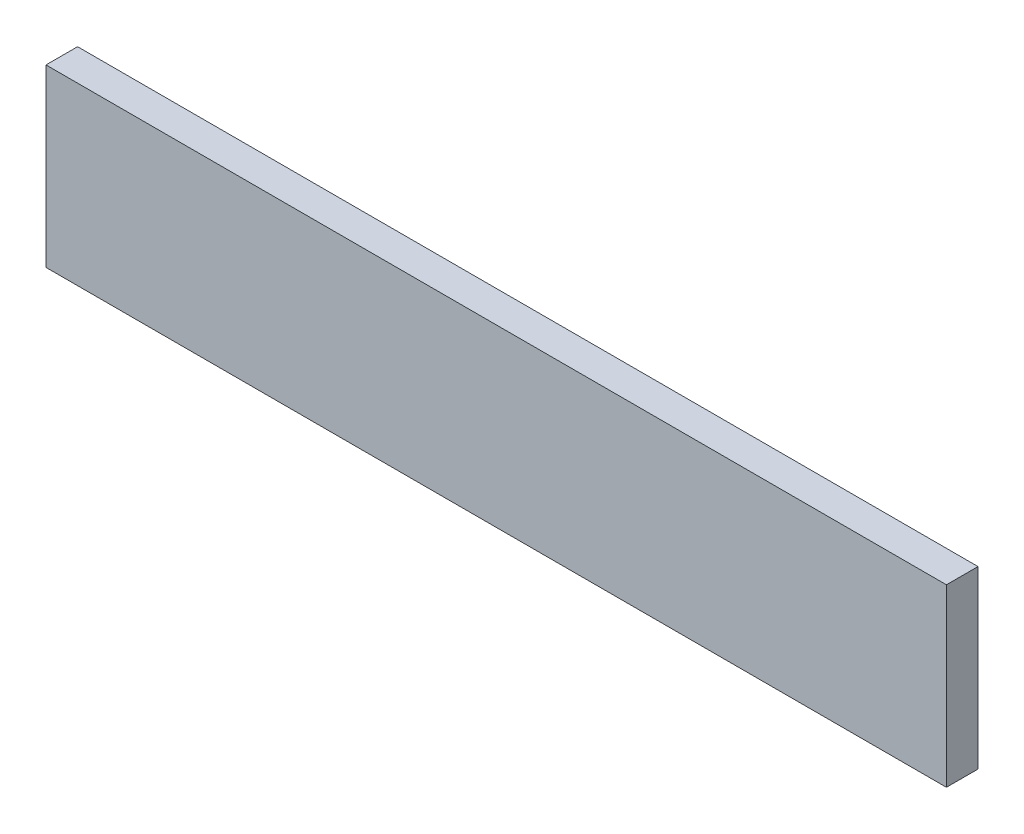
ISO-10303-21;
HEADER;
FILE_DESCRIPTION(('STEP AP214'),'2;1');
FILE_NAME('part.step','',(''),(''),'','','');
FILE_SCHEMA(('AUTOMOTIVE_DESIGN { 1 0 10303 214 1 1 1 1 }'));
ENDSEC;
DATA;
#1=APPLICATION_CONTEXT('core data for automotive mechanical design processes');
#2=APPLICATION_PROTOCOL_DEFINITION('international standard','automotive_design',2000,#1);
#3=PRODUCT_CONTEXT('',#1,'mechanical');
#4=PRODUCT('Part','Part','',(#3));
#5=PRODUCT_RELATED_PRODUCT_CATEGORY('part','',(#4));
#6=PRODUCT_DEFINITION_FORMATION('','',#4);
#7=PRODUCT_DEFINITION_CONTEXT('part definition',#1,'design');
#8=PRODUCT_DEFINITION('design','',#6,#7);
#9=PRODUCT_DEFINITION_SHAPE('','',#8);
#10=(LENGTH_UNIT() NAMED_UNIT(*) SI_UNIT(.MILLI.,.METRE.));
#11=(NAMED_UNIT(*) PLANE_ANGLE_UNIT() SI_UNIT($,.RADIAN.));
#12=(NAMED_UNIT(*) SI_UNIT($,.STERADIAN.) SOLID_ANGLE_UNIT());
#13=UNCERTAINTY_MEASURE_WITH_UNIT(LENGTH_MEASURE(1.E-05),#10,'distance_accuracy_value','');
#14=(GEOMETRIC_REPRESENTATION_CONTEXT(3) GLOBAL_UNCERTAINTY_ASSIGNED_CONTEXT((#13)) GLOBAL_UNIT_ASSIGNED_CONTEXT((#10,
#11,#12)) REPRESENTATION_CONTEXT('',''));
#15=CARTESIAN_POINT('',(0.,0.,0.));
#16=DIRECTION('',(0.,0.,1.));
#17=DIRECTION('',(1.,0.,0.));
#18=AXIS2_PLACEMENT_3D('',#15,#16,#17);
#19=CARTESIAN_POINT('',(0.,0.,27.));
#20=DIRECTION('',(1.,0.,0.));
#21=DIRECTION('',(0.,0.,-1.));
#22=AXIS2_PLACEMENT_3D('',#19,#20,#21);
#23=PLANE('',#22);
#24=DIRECTION('',(0.,-1.,0.));
#25=VECTOR('',#24,1.);
#26=CARTESIAN_POINT('',(0.,0.,0.));
#27=LINE('',#26,#25);
#28=CARTESIAN_POINT('',(0.,150.,0.));
#29=VERTEX_POINT('',#28);
#30=CARTESIAN_POINT('',(0.,0.,0.));
#31=VERTEX_POINT('',#30);
#32=EDGE_CURVE('E96',#29,#31,#27,.T.);
#33=ORIENTED_EDGE('',*,*,#32,.T.);
#34=DIRECTION('',(0.,0.,-1.));
#35=VECTOR('',#34,1.);
#36=CARTESIAN_POINT('',(0.,0.,27.));
#37=LINE('',#36,#35);
#38=CARTESIAN_POINT('',(0.,0.,27.));
#39=VERTEX_POINT('',#38);
#40=EDGE_CURVE('E11',#39,#31,#37,.T.);
#41=ORIENTED_EDGE('',*,*,#40,.F.);
#42=DIRECTION('',(0.,-1.,0.));
#43=VECTOR('',#42,1.);
#44=CARTESIAN_POINT('',(0.,0.,27.));
#45=LINE('',#44,#43);
#46=CARTESIAN_POINT('',(0.,150.,27.));
#47=VERTEX_POINT('',#46);
#48=EDGE_CURVE('E84',#47,#39,#45,.T.);
#49=ORIENTED_EDGE('',*,*,#48,.F.);
#50=DIRECTION('',(0.,0.,-1.));
#51=VECTOR('',#50,1.);
#52=CARTESIAN_POINT('',(0.,150.,27.));
#53=LINE('',#52,#51);
#54=EDGE_CURVE('E92',#47,#29,#53,.T.);
#55=ORIENTED_EDGE('',*,*,#54,.T.);
#56=EDGE_LOOP('',(#33,#41,#49,#55));
#57=FACE_BOUND('',#56,.T.);
#58=ADVANCED_FACE('F33',(#57),#23,.F.);
#59=CARTESIAN_POINT('',(0.,0.,27.));
#60=DIRECTION('',(0.,1.,0.));
#61=DIRECTION('',(0.,0.,1.));
#62=AXIS2_PLACEMENT_3D('',#59,#60,#61);
#63=PLANE('',#62);
#64=DIRECTION('',(1.,0.,0.));
#65=VECTOR('',#64,1.);
#66=CARTESIAN_POINT('',(0.,0.,0.));
#67=LINE('',#66,#65);
#68=CARTESIAN_POINT('',(770.,0.,0.));
#69=VERTEX_POINT('',#68);
#70=EDGE_CURVE('E88',#31,#69,#67,.T.);
#71=ORIENTED_EDGE('',*,*,#70,.T.);
#72=DIRECTION('',(0.,0.,-1.));
#73=VECTOR('',#72,1.);
#74=CARTESIAN_POINT('',(770.,0.,27.));
#75=LINE('',#74,#73);
#76=CARTESIAN_POINT('',(770.,0.,27.));
#77=VERTEX_POINT('',#76);
#78=EDGE_CURVE('E41',#77,#69,#75,.T.);
#79=ORIENTED_EDGE('',*,*,#78,.F.);
#80=DIRECTION('',(1.,0.,0.));
#81=VECTOR('',#80,1.);
#82=CARTESIAN_POINT('',(0.,0.,27.));
#83=LINE('',#82,#81);
#84=EDGE_CURVE('E79',#39,#77,#83,.T.);
#85=ORIENTED_EDGE('',*,*,#84,.F.);
#86=ORIENTED_EDGE('',*,*,#40,.T.);
#87=EDGE_LOOP('',(#71,#79,#85,#86));
#88=FACE_BOUND('',#87,.T.);
#89=ADVANCED_FACE('F87',(#88),#63,.F.);
#90=CARTESIAN_POINT('',(770.,0.,27.));
#91=DIRECTION('',(-1.,0.,0.));
#92=DIRECTION('',(0.,0.,1.));
#93=AXIS2_PLACEMENT_3D('',#90,#91,#92);
#94=PLANE('',#93);
#95=DIRECTION('',(0.,1.,0.));
#96=VECTOR('',#95,1.);
#97=CARTESIAN_POINT('',(770.,0.,0.));
#98=LINE('',#97,#96);
#99=CARTESIAN_POINT('',(770.,150.,0.));
#100=VERTEX_POINT('',#99);
#101=EDGE_CURVE('E66',#69,#100,#98,.T.);
#102=ORIENTED_EDGE('',*,*,#101,.T.);
#103=DIRECTION('',(0.,0.,-1.));
#104=VECTOR('',#103,1.);
#105=CARTESIAN_POINT('',(770.,150.,27.));
#106=LINE('',#105,#104);
#107=CARTESIAN_POINT('',(770.,150.,27.));
#108=VERTEX_POINT('',#107);
#109=EDGE_CURVE('E89',#108,#100,#106,.T.);
#110=ORIENTED_EDGE('',*,*,#109,.F.);
#111=DIRECTION('',(0.,1.,0.));
#112=VECTOR('',#111,1.);
#113=CARTESIAN_POINT('',(770.,0.,27.));
#114=LINE('',#113,#112);
#115=EDGE_CURVE('E82',#77,#108,#114,.T.);
#116=ORIENTED_EDGE('',*,*,#115,.F.);
#117=ORIENTED_EDGE('',*,*,#78,.T.);
#118=EDGE_LOOP('',(#102,#110,#116,#117));
#119=FACE_BOUND('',#118,.T.);
#120=ADVANCED_FACE('F90',(#119),#94,.F.);
#121=CARTESIAN_POINT('',(0.,150.,27.));
#122=DIRECTION('',(0.,-1.,0.));
#123=DIRECTION('',(0.,0.,-1.));
#124=AXIS2_PLACEMENT_3D('',#121,#122,#123);
#125=PLANE('',#124);
#126=DIRECTION('',(-1.,0.,0.));
#127=VECTOR('',#126,1.);
#128=CARTESIAN_POINT('',(0.,150.,0.));
#129=LINE('',#128,#127);
#130=EDGE_CURVE('E72',#100,#29,#129,.T.);
#131=ORIENTED_EDGE('',*,*,#130,.T.);
#132=ORIENTED_EDGE('',*,*,#54,.F.);
#133=DIRECTION('',(-1.,0.,0.));
#134=VECTOR('',#133,1.);
#135=CARTESIAN_POINT('',(0.,150.,27.));
#136=LINE('',#135,#134);
#137=EDGE_CURVE('E49',#108,#47,#136,.T.);
#138=ORIENTED_EDGE('',*,*,#137,.F.);
#139=ORIENTED_EDGE('',*,*,#109,.T.);
#140=EDGE_LOOP('',(#131,#132,#138,#139));
#141=FACE_BOUND('',#140,.T.);
#142=ADVANCED_FACE('F103',(#141),#125,.F.);
#143=CARTESIAN_POINT('',(0.,0.,27.));
#144=DIRECTION('',(0.,0.,-1.));
#145=DIRECTION('',(-1.,0.,0.));
#146=AXIS2_PLACEMENT_3D('',#143,#144,#145);
#147=PLANE('',#146);
#148=ORIENTED_EDGE('',*,*,#48,.T.);
#149=ORIENTED_EDGE('',*,*,#84,.T.);
#150=ORIENTED_EDGE('',*,*,#115,.T.);
#151=ORIENTED_EDGE('',*,*,#137,.T.);
#152=EDGE_LOOP('',(#148,#149,#150,#151));
#153=FACE_BOUND('',#152,.T.);
#154=ADVANCED_FACE('F80',(#153),#147,.F.);
#155=CARTESIAN_POINT('',(0.,0.,0.));
#156=DIRECTION('',(0.,0.,-1.));
#157=DIRECTION('',(-1.,0.,0.));
#158=AXIS2_PLACEMENT_3D('',#155,#156,#157);
#159=PLANE('',#158);
#160=ORIENTED_EDGE('',*,*,#32,.F.);
#161=ORIENTED_EDGE('',*,*,#130,.F.);
#162=ORIENTED_EDGE('',*,*,#101,.F.);
#163=ORIENTED_EDGE('',*,*,#70,.F.);
#164=EDGE_LOOP('',(#160,#161,#162,#163));
#165=FACE_BOUND('',#164,.T.);
#166=ADVANCED_FACE('F106',(#165),#159,.T.);
#167=CLOSED_SHELL('',(#58,#89,#120,#142,#154,#166));
#168=MANIFOLD_SOLID_BREP('B2',#167);
#169=ADVANCED_BREP_SHAPE_REPRESENTATION('',(#18,#168),#14);
#170=SHAPE_DEFINITION_REPRESENTATION(#9,#169);
ENDSEC;
END-ISO-10303-21;
